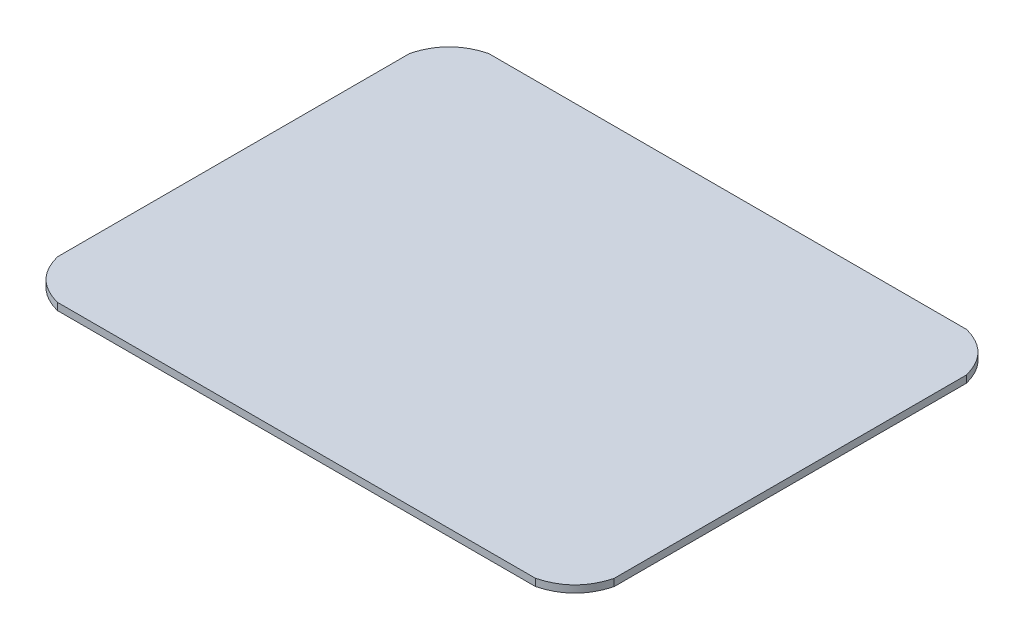
ISO-10303-21;
HEADER;
FILE_DESCRIPTION(('STEP AP214'),'2;1');
FILE_NAME('part.step','',(''),(''),'','','');
FILE_SCHEMA(('AUTOMOTIVE_DESIGN { 1 0 10303 214 1 1 1 1 }'));
ENDSEC;
DATA;
#1=APPLICATION_CONTEXT('core data for automotive mechanical design processes');
#2=APPLICATION_PROTOCOL_DEFINITION('international standard','automotive_design',2000,#1);
#3=PRODUCT_CONTEXT('',#1,'mechanical');
#4=PRODUCT('Part','Part','',(#3));
#5=PRODUCT_RELATED_PRODUCT_CATEGORY('part','',(#4));
#6=PRODUCT_DEFINITION_FORMATION('','',#4);
#7=PRODUCT_DEFINITION_CONTEXT('part definition',#1,'design');
#8=PRODUCT_DEFINITION('design','',#6,#7);
#9=PRODUCT_DEFINITION_SHAPE('','',#8);
#10=(LENGTH_UNIT() NAMED_UNIT(*) SI_UNIT(.MILLI.,.METRE.));
#11=(NAMED_UNIT(*) PLANE_ANGLE_UNIT() SI_UNIT($,.RADIAN.));
#12=(NAMED_UNIT(*) SI_UNIT($,.STERADIAN.) SOLID_ANGLE_UNIT());
#13=UNCERTAINTY_MEASURE_WITH_UNIT(LENGTH_MEASURE(1.E-05),#10,'distance_accuracy_value','');
#14=(GEOMETRIC_REPRESENTATION_CONTEXT(3) GLOBAL_UNCERTAINTY_ASSIGNED_CONTEXT((#13)) GLOBAL_UNIT_ASSIGNED_CONTEXT((#10,
#11,#12)) REPRESENTATION_CONTEXT('',''));
#15=CARTESIAN_POINT('',(0.,0.,0.));
#16=DIRECTION('',(0.,0.,1.));
#17=DIRECTION('',(1.,0.,0.));
#18=AXIS2_PLACEMENT_3D('',#15,#16,#17);
#19=CARTESIAN_POINT('',(105.623942912155,3.175,95.2500000000001));
#20=CARTESIAN_POINT('',(119.376750647122,3.175,91.6105336507039));
#21=CARTESIAN_POINT('',(123.03125,3.175,77.8604715000052));
#22=B_SPLINE_CURVE_WITH_KNOTS('',2,(#19,#20,#21),.UNSPECIFIED.,.F.,.F.,(3,3),(0.,1.),.UNSPECIFIED.);
#23=DIRECTION('',(0.,-1.,0.));
#24=VECTOR('',#23,1.);
#25=SURFACE_OF_LINEAR_EXTRUSION('',#22,#24);
#26=CARTESIAN_POINT('',(105.623942912155,0.,95.2500000000001));
#27=CARTESIAN_POINT('',(119.376750647122,0.,91.6105336507039));
#28=CARTESIAN_POINT('',(123.03125,0.,77.8604715000052));
#29=B_SPLINE_CURVE_WITH_KNOTS('',2,(#26,#27,#28),.UNSPECIFIED.,.F.,.F.,(3,3),(0.,1.),.UNSPECIFIED.);
#30=CARTESIAN_POINT('',(105.623942912155,0.,95.25));
#31=VERTEX_POINT('',#30);
#32=CARTESIAN_POINT('',(123.03125,0.,77.8604715000052));
#33=VERTEX_POINT('',#32);
#34=EDGE_CURVE('E193',#31,#33,#29,.T.);
#35=ORIENTED_EDGE('',*,*,#34,.T.);
#36=DIRECTION('',(0.,-1.,0.));
#37=VECTOR('',#36,1.);
#38=CARTESIAN_POINT('',(123.03125,3.175,77.8604715000052));
#39=LINE('',#38,#37);
#40=CARTESIAN_POINT('',(123.03125,3.175,77.8604715000052));
#41=VERTEX_POINT('',#40);
#42=EDGE_CURVE('E11',#41,#33,#39,.T.);
#43=ORIENTED_EDGE('',*,*,#42,.F.);
#44=CARTESIAN_POINT('',(105.623942912155,3.175,95.25));
#45=VERTEX_POINT('',#44);
#46=EDGE_CURVE('E225',#45,#41,#22,.T.);
#47=ORIENTED_EDGE('',*,*,#46,.F.);
#48=DIRECTION('',(0.,-1.,0.));
#49=VECTOR('',#48,1.);
#50=CARTESIAN_POINT('',(105.623942912155,3.175,95.25));
#51=LINE('',#50,#49);
#52=EDGE_CURVE('E134',#45,#31,#51,.T.);
#53=ORIENTED_EDGE('',*,*,#52,.T.);
#54=EDGE_LOOP('',(#35,#43,#47,#53));
#55=FACE_BOUND('',#54,.T.);
#56=ADVANCED_FACE('F41',(#55),#25,.F.);
#57=CARTESIAN_POINT('',(123.03125,3.175,77.8604715000052));
#58=DIRECTION('',(-1.,0.,0.));
#59=DIRECTION('',(0.,0.,1.));
#60=AXIS2_PLACEMENT_3D('',#57,#58,#59);
#61=PLANE('',#60);
#62=DIRECTION('',(0.,0.,-1.));
#63=VECTOR('',#62,1.);
#64=CARTESIAN_POINT('',(123.03125,0.,77.8604715000052));
#65=LINE('',#64,#63);
#66=CARTESIAN_POINT('',(123.03125,0.,-77.8604715000049));
#67=VERTEX_POINT('',#66);
#68=EDGE_CURVE('E184',#33,#67,#65,.T.);
#69=ORIENTED_EDGE('',*,*,#68,.T.);
#70=DIRECTION('',(0.,-1.,0.));
#71=VECTOR('',#70,1.);
#72=CARTESIAN_POINT('',(123.03125,3.175,-77.8604715000049));
#73=LINE('',#72,#71);
#74=CARTESIAN_POINT('',(123.03125,3.175,-77.8604715000049));
#75=VERTEX_POINT('',#74);
#76=EDGE_CURVE('E50',#75,#67,#73,.T.);
#77=ORIENTED_EDGE('',*,*,#76,.F.);
#78=DIRECTION('',(0.,0.,-1.));
#79=VECTOR('',#78,1.);
#80=CARTESIAN_POINT('',(123.03125,3.175,77.8604715000052));
#81=LINE('',#80,#79);
#82=EDGE_CURVE('E101',#41,#75,#81,.T.);
#83=ORIENTED_EDGE('',*,*,#82,.F.);
#84=ORIENTED_EDGE('',*,*,#42,.T.);
#85=EDGE_LOOP('',(#69,#77,#83,#84));
#86=FACE_BOUND('',#85,.T.);
#87=ADVANCED_FACE('F177',(#86),#61,.F.);
#88=CARTESIAN_POINT('',(123.03125,3.175,-77.8604715000049));
#89=CARTESIAN_POINT('',(119.376750647122,3.175,-91.6105336507037));
#90=CARTESIAN_POINT('',(105.623942912155,3.175,-95.2499999999998));
#91=B_SPLINE_CURVE_WITH_KNOTS('',2,(#88,#89,#90),.UNSPECIFIED.,.F.,.F.,(3,3),(0.,1.),.UNSPECIFIED.);
#92=DIRECTION('',(0.,-1.,0.));
#93=VECTOR('',#92,1.);
#94=SURFACE_OF_LINEAR_EXTRUSION('',#91,#93);
#95=CARTESIAN_POINT('',(123.03125,0.,-77.8604715000049));
#96=CARTESIAN_POINT('',(119.376750647122,0.,-91.6105336507037));
#97=CARTESIAN_POINT('',(105.623942912155,0.,-95.2499999999998));
#98=B_SPLINE_CURVE_WITH_KNOTS('',2,(#95,#96,#97),.UNSPECIFIED.,.F.,.F.,(3,3),(0.,1.),.UNSPECIFIED.);
#99=CARTESIAN_POINT('',(105.623942912155,0.,-95.2499999999998));
#100=VERTEX_POINT('',#99);
#101=EDGE_CURVE('E192',#67,#100,#98,.T.);
#102=ORIENTED_EDGE('',*,*,#101,.T.);
#103=DIRECTION('',(0.,-1.,0.));
#104=VECTOR('',#103,1.);
#105=CARTESIAN_POINT('',(105.623942912155,3.175,-95.2499999999998));
#106=LINE('',#105,#104);
#107=CARTESIAN_POINT('',(105.623942912155,3.175,-95.2499999999998));
#108=VERTEX_POINT('',#107);
#109=EDGE_CURVE('E197',#108,#100,#106,.T.);
#110=ORIENTED_EDGE('',*,*,#109,.F.);
#111=EDGE_CURVE('E167',#75,#108,#91,.T.);
#112=ORIENTED_EDGE('',*,*,#111,.F.);
#113=ORIENTED_EDGE('',*,*,#76,.T.);
#114=EDGE_LOOP('',(#102,#110,#112,#113));
#115=FACE_BOUND('',#114,.T.);
#116=ADVANCED_FACE('F175',(#115),#94,.F.);
#117=CARTESIAN_POINT('',(105.623942912155,3.175,-95.2499999999998));
#118=DIRECTION('',(0.,0.,1.));
#119=DIRECTION('',(1.,0.,0.));
#120=AXIS2_PLACEMENT_3D('',#117,#118,#119);
#121=PLANE('',#120);
#122=DIRECTION('',(-1.,0.,0.));
#123=VECTOR('',#122,1.);
#124=CARTESIAN_POINT('',(105.623942912155,0.,-95.2499999999998));
#125=LINE('',#124,#123);
#126=CARTESIAN_POINT('',(-105.623942912155,0.,-95.2499999999998));
#127=VERTEX_POINT('',#126);
#128=EDGE_CURVE('E201',#100,#127,#125,.T.);
#129=ORIENTED_EDGE('',*,*,#128,.T.);
#130=DIRECTION('',(0.,-1.,0.));
#131=VECTOR('',#130,1.);
#132=CARTESIAN_POINT('',(-105.623942912155,3.175,-95.2499999999998));
#133=LINE('',#132,#131);
#134=CARTESIAN_POINT('',(-105.623942912155,3.175,-95.2499999999998));
#135=VERTEX_POINT('',#134);
#136=EDGE_CURVE('E229',#135,#127,#133,.T.);
#137=ORIENTED_EDGE('',*,*,#136,.F.);
#138=DIRECTION('',(-1.,0.,0.));
#139=VECTOR('',#138,1.);
#140=CARTESIAN_POINT('',(105.623942912155,3.175,-95.2499999999998));
#141=LINE('',#140,#139);
#142=EDGE_CURVE('E162',#108,#135,#141,.T.);
#143=ORIENTED_EDGE('',*,*,#142,.F.);
#144=ORIENTED_EDGE('',*,*,#109,.T.);
#145=EDGE_LOOP('',(#129,#137,#143,#144));
#146=FACE_BOUND('',#145,.T.);
#147=ADVANCED_FACE('F155',(#146),#121,.F.);
#148=CARTESIAN_POINT('',(-105.623942912155,3.175,-95.2499999999998));
#149=CARTESIAN_POINT('',(-119.376750647122,3.175,-91.6105336507037));
#150=CARTESIAN_POINT('',(-123.03125,3.175,-77.860471500005));
#151=B_SPLINE_CURVE_WITH_KNOTS('',2,(#148,#149,#150),.UNSPECIFIED.,.F.,.F.,(3,3),(0.,1.),.UNSPECIFIED.);
#152=DIRECTION('',(0.,-1.,0.));
#153=VECTOR('',#152,1.);
#154=SURFACE_OF_LINEAR_EXTRUSION('',#151,#153);
#155=CARTESIAN_POINT('',(-105.623942912155,0.,-95.2499999999998));
#156=CARTESIAN_POINT('',(-119.376750647122,0.,-91.6105336507037));
#157=CARTESIAN_POINT('',(-123.03125,0.,-77.860471500005));
#158=B_SPLINE_CURVE_WITH_KNOTS('',2,(#155,#156,#157),.UNSPECIFIED.,.F.,.F.,(3,3),(0.,1.),.UNSPECIFIED.);
#159=CARTESIAN_POINT('',(-123.03125,0.,-77.860471500005));
#160=VERTEX_POINT('',#159);
#161=EDGE_CURVE('E203',#127,#160,#158,.T.);
#162=ORIENTED_EDGE('',*,*,#161,.T.);
#163=DIRECTION('',(0.,-1.,0.));
#164=VECTOR('',#163,1.);
#165=CARTESIAN_POINT('',(-123.03125,3.175,-77.860471500005));
#166=LINE('',#165,#164);
#167=CARTESIAN_POINT('',(-123.03125,3.175,-77.860471500005));
#168=VERTEX_POINT('',#167);
#169=EDGE_CURVE('E129',#168,#160,#166,.T.);
#170=ORIENTED_EDGE('',*,*,#169,.F.);
#171=EDGE_CURVE('E120',#135,#168,#151,.T.);
#172=ORIENTED_EDGE('',*,*,#171,.F.);
#173=ORIENTED_EDGE('',*,*,#136,.T.);
#174=EDGE_LOOP('',(#162,#170,#172,#173));
#175=FACE_BOUND('',#174,.T.);
#176=ADVANCED_FACE('F152',(#175),#154,.F.);
#177=CARTESIAN_POINT('',(-123.03125,3.175,-77.860471500005));
#178=DIRECTION('',(1.,0.,0.));
#179=DIRECTION('',(0.,0.,-1.));
#180=AXIS2_PLACEMENT_3D('',#177,#178,#179);
#181=PLANE('',#180);
#182=DIRECTION('',(0.,0.,1.));
#183=VECTOR('',#182,1.);
#184=CARTESIAN_POINT('',(-123.03125,0.,-77.860471500005));
#185=LINE('',#184,#183);
#186=CARTESIAN_POINT('',(-123.03125,0.,77.8604715000052));
#187=VERTEX_POINT('',#186);
#188=EDGE_CURVE('E128',#160,#187,#185,.T.);
#189=ORIENTED_EDGE('',*,*,#188,.T.);
#190=DIRECTION('',(0.,-1.,0.));
#191=VECTOR('',#190,1.);
#192=CARTESIAN_POINT('',(-123.03125,3.175,77.8604715000052));
#193=LINE('',#192,#191);
#194=CARTESIAN_POINT('',(-123.03125,3.175,77.8604715000052));
#195=VERTEX_POINT('',#194);
#196=EDGE_CURVE('E125',#195,#187,#193,.T.);
#197=ORIENTED_EDGE('',*,*,#196,.F.);
#198=DIRECTION('',(0.,0.,1.));
#199=VECTOR('',#198,1.);
#200=CARTESIAN_POINT('',(-123.03125,3.175,-77.860471500005));
#201=LINE('',#200,#199);
#202=EDGE_CURVE('E114',#168,#195,#201,.T.);
#203=ORIENTED_EDGE('',*,*,#202,.F.);
#204=ORIENTED_EDGE('',*,*,#169,.T.);
#205=EDGE_LOOP('',(#189,#197,#203,#204));
#206=FACE_BOUND('',#205,.T.);
#207=ADVANCED_FACE('F126',(#206),#181,.F.);
#208=CARTESIAN_POINT('',(-123.03125,3.175,77.8604715000052));
#209=CARTESIAN_POINT('',(-119.376750647122,3.175,91.6105336507039));
#210=CARTESIAN_POINT('',(-105.623942912155,3.175,95.2500000000001));
#211=B_SPLINE_CURVE_WITH_KNOTS('',2,(#208,#209,#210),.UNSPECIFIED.,.F.,.F.,(3,3),(0.,1.),.UNSPECIFIED.);
#212=DIRECTION('',(0.,-1.,0.));
#213=VECTOR('',#212,1.);
#214=SURFACE_OF_LINEAR_EXTRUSION('',#211,#213);
#215=CARTESIAN_POINT('',(-123.03125,0.,77.8604715000052));
#216=CARTESIAN_POINT('',(-119.376750647122,0.,91.6105336507039));
#217=CARTESIAN_POINT('',(-105.623942912155,0.,95.2500000000001));
#218=B_SPLINE_CURVE_WITH_KNOTS('',2,(#215,#216,#217),.UNSPECIFIED.,.F.,.F.,(3,3),(0.,1.),.UNSPECIFIED.);
#219=CARTESIAN_POINT('',(-105.623942912155,0.,95.2500000000001));
#220=VERTEX_POINT('',#219);
#221=EDGE_CURVE('E87',#187,#220,#218,.T.);
#222=ORIENTED_EDGE('',*,*,#221,.T.);
#223=DIRECTION('',(0.,-1.,0.));
#224=VECTOR('',#223,1.);
#225=CARTESIAN_POINT('',(-105.623942912155,3.175,95.2500000000001));
#226=LINE('',#225,#224);
#227=CARTESIAN_POINT('',(-105.623942912155,3.175,95.2500000000001));
#228=VERTEX_POINT('',#227);
#229=EDGE_CURVE('E130',#228,#220,#226,.T.);
#230=ORIENTED_EDGE('',*,*,#229,.F.);
#231=EDGE_CURVE('E118',#195,#228,#211,.T.);
#232=ORIENTED_EDGE('',*,*,#231,.F.);
#233=ORIENTED_EDGE('',*,*,#196,.T.);
#234=EDGE_LOOP('',(#222,#230,#232,#233));
#235=FACE_BOUND('',#234,.T.);
#236=ADVANCED_FACE('F132',(#235),#214,.F.);
#237=CARTESIAN_POINT('',(-105.623942912155,3.175,95.2500000000001));
#238=DIRECTION('',(0.,0.,-1.));
#239=DIRECTION('',(-1.,0.,0.));
#240=AXIS2_PLACEMENT_3D('',#237,#238,#239);
#241=PLANE('',#240);
#242=DIRECTION('',(1.,0.,0.));
#243=VECTOR('',#242,1.);
#244=CARTESIAN_POINT('',(-105.623942912155,0.,95.2500000000001));
#245=LINE('',#244,#243);
#246=EDGE_CURVE('E93',#220,#31,#245,.T.);
#247=ORIENTED_EDGE('',*,*,#246,.T.);
#248=ORIENTED_EDGE('',*,*,#52,.F.);
#249=DIRECTION('',(1.,0.,0.));
#250=VECTOR('',#249,1.);
#251=CARTESIAN_POINT('',(-105.623942912155,3.175,95.2500000000001));
#252=LINE('',#251,#250);
#253=EDGE_CURVE('E58',#228,#45,#252,.T.);
#254=ORIENTED_EDGE('',*,*,#253,.F.);
#255=ORIENTED_EDGE('',*,*,#229,.T.);
#256=EDGE_LOOP('',(#247,#248,#254,#255));
#257=FACE_BOUND('',#256,.T.);
#258=ADVANCED_FACE('F148',(#257),#241,.F.);
#259=CARTESIAN_POINT('',(116.8521735516,3.175,89.0828847003532));
#260=DIRECTION('',(0.,-1.,0.));
#261=DIRECTION('',(0.,0.,-1.));
#262=AXIS2_PLACEMENT_3D('',#259,#260,#261);
#263=PLANE('',#262);
#264=ORIENTED_EDGE('',*,*,#46,.T.);
#265=ORIENTED_EDGE('',*,*,#82,.T.);
#266=ORIENTED_EDGE('',*,*,#111,.T.);
#267=ORIENTED_EDGE('',*,*,#142,.T.);
#268=ORIENTED_EDGE('',*,*,#171,.T.);
#269=ORIENTED_EDGE('',*,*,#202,.T.);
#270=ORIENTED_EDGE('',*,*,#231,.T.);
#271=ORIENTED_EDGE('',*,*,#253,.T.);
#272=EDGE_LOOP('',(#264,#265,#266,#267,#268,#269,#270,#271));
#273=FACE_BOUND('',#272,.T.);
#274=ADVANCED_FACE('F116',(#273),#263,.F.);
#275=CARTESIAN_POINT('',(116.8521735516,0.,89.0828847003532));
#276=DIRECTION('',(0.,-1.,0.));
#277=DIRECTION('',(0.,0.,-1.));
#278=AXIS2_PLACEMENT_3D('',#275,#276,#277);
#279=PLANE('',#278);
#280=ORIENTED_EDGE('',*,*,#34,.F.);
#281=ORIENTED_EDGE('',*,*,#246,.F.);
#282=ORIENTED_EDGE('',*,*,#221,.F.);
#283=ORIENTED_EDGE('',*,*,#188,.F.);
#284=ORIENTED_EDGE('',*,*,#161,.F.);
#285=ORIENTED_EDGE('',*,*,#128,.F.);
#286=ORIENTED_EDGE('',*,*,#101,.F.);
#287=ORIENTED_EDGE('',*,*,#68,.F.);
#288=EDGE_LOOP('',(#280,#281,#282,#283,#284,#285,#286,#287));
#289=FACE_BOUND('',#288,.T.);
#290=ADVANCED_FACE('F199',(#289),#279,.T.);
#291=CLOSED_SHELL('',(#56,#87,#116,#147,#176,#207,#236,#258,#274,#290));
#292=MANIFOLD_SOLID_BREP('B2',#291);
#293=ADVANCED_BREP_SHAPE_REPRESENTATION('',(#18,#292),#14);
#294=SHAPE_DEFINITION_REPRESENTATION(#9,#293);
ENDSEC;
END-ISO-10303-21;
